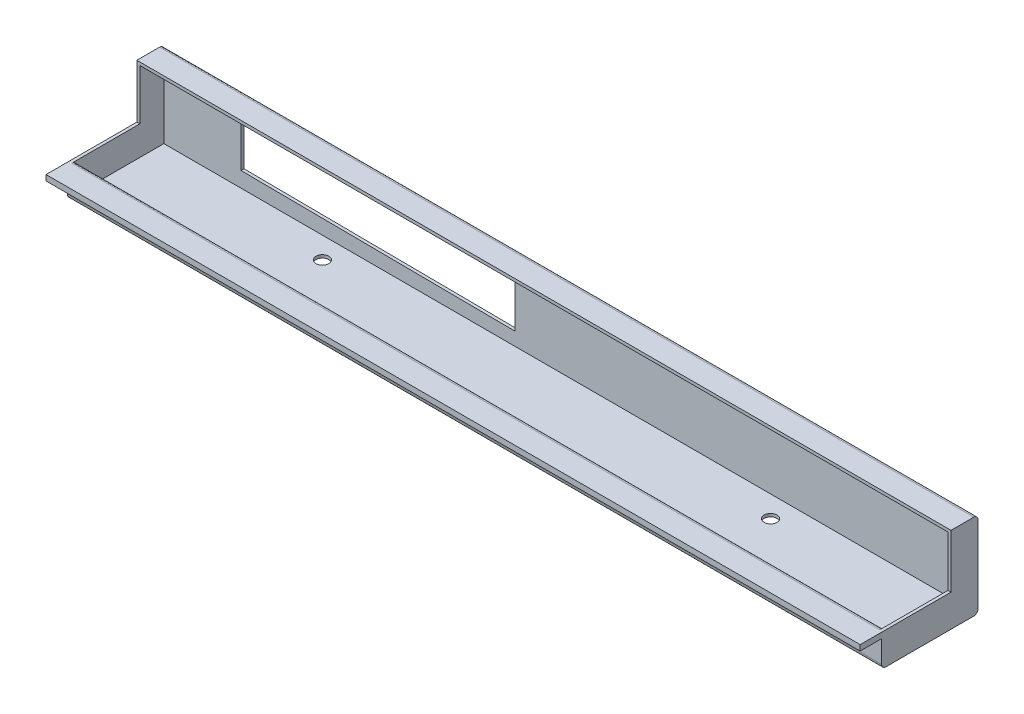
ISO-10303-21;
HEADER;
FILE_DESCRIPTION(('STEP AP214'),'2;1');
FILE_NAME('part.step','',(''),(''),'','','');
FILE_SCHEMA(('AUTOMOTIVE_DESIGN { 1 0 10303 214 1 1 1 1 }'));
ENDSEC;
DATA;
#1=APPLICATION_CONTEXT('core data for automotive mechanical design processes');
#2=APPLICATION_PROTOCOL_DEFINITION('international standard','automotive_design',2000,#1);
#3=PRODUCT_CONTEXT('',#1,'mechanical');
#4=PRODUCT('Part','Part','',(#3));
#5=PRODUCT_RELATED_PRODUCT_CATEGORY('part','',(#4));
#6=PRODUCT_DEFINITION_FORMATION('','',#4);
#7=PRODUCT_DEFINITION_CONTEXT('part definition',#1,'design');
#8=PRODUCT_DEFINITION('design','',#6,#7);
#9=PRODUCT_DEFINITION_SHAPE('','',#8);
#10=(LENGTH_UNIT() NAMED_UNIT(*) SI_UNIT(.MILLI.,.METRE.));
#11=(NAMED_UNIT(*) PLANE_ANGLE_UNIT() SI_UNIT($,.RADIAN.));
#12=(NAMED_UNIT(*) SI_UNIT($,.STERADIAN.) SOLID_ANGLE_UNIT());
#13=UNCERTAINTY_MEASURE_WITH_UNIT(LENGTH_MEASURE(1.E-05),#10,'distance_accuracy_value','');
#14=(GEOMETRIC_REPRESENTATION_CONTEXT(3) GLOBAL_UNCERTAINTY_ASSIGNED_CONTEXT((#13)) GLOBAL_UNIT_ASSIGNED_CONTEXT((#10,
#11,#12)) REPRESENTATION_CONTEXT('',''));
#15=CARTESIAN_POINT('',(0.,0.,0.));
#16=DIRECTION('',(0.,0.,1.));
#17=DIRECTION('',(1.,0.,0.));
#18=AXIS2_PLACEMENT_3D('',#15,#16,#17);
#19=CARTESIAN_POINT('',(0.,0.,1.778));
#20=DIRECTION('',(0.,0.,-1.));
#21=DIRECTION('',(-1.,0.,0.));
#22=AXIS2_PLACEMENT_3D('',#19,#20,#21);
#23=PLANE('',#22);
#24=DIRECTION('',(0.,1.,0.));
#25=VECTOR('',#24,1.);
#26=CARTESIAN_POINT('',(239.522,0.,1.778));
#27=LINE('',#26,#25);
#28=CARTESIAN_POINT('',(239.522,-23.622,1.778));
#29=VERTEX_POINT('',#28);
#30=CARTESIAN_POINT('',(239.522,23.622,1.778));
#31=VERTEX_POINT('',#30);
#32=EDGE_CURVE('E241',#29,#31,#27,.T.);
#33=ORIENTED_EDGE('',*,*,#32,.T.);
#34=DIRECTION('',(-1.,0.,0.));
#35=VECTOR('',#34,1.);
#36=CARTESIAN_POINT('',(0.,23.622,1.778));
#37=LINE('',#36,#35);
#38=CARTESIAN_POINT('',(-239.522,23.622,1.778));
#39=VERTEX_POINT('',#38);
#40=EDGE_CURVE('E244',#31,#39,#37,.T.);
#41=ORIENTED_EDGE('',*,*,#40,.T.);
#42=DIRECTION('',(0.,-1.,0.));
#43=VECTOR('',#42,1.);
#44=CARTESIAN_POINT('',(-239.522,0.,1.778));
#45=LINE('',#44,#43);
#46=CARTESIAN_POINT('',(-239.522,-23.622,1.778));
#47=VERTEX_POINT('',#46);
#48=EDGE_CURVE('E251',#39,#47,#45,.T.);
#49=ORIENTED_EDGE('',*,*,#48,.T.);
#50=DIRECTION('',(1.,0.,0.));
#51=VECTOR('',#50,1.);
#52=CARTESIAN_POINT('',(0.,-23.622,1.778));
#53=LINE('',#52,#51);
#54=EDGE_CURVE('E240',#47,#29,#53,.T.);
#55=ORIENTED_EDGE('',*,*,#54,.T.);
#56=EDGE_LOOP('',(#33,#41,#49,#55));
#57=FACE_BOUND('',#56,.T.);
#58=DIRECTION('',(0.,1.,0.));
#59=VECTOR('',#58,1.);
#60=CARTESIAN_POINT('',(-31.482,13.4000000000001,1.778));
#61=LINE('',#60,#59);
#62=CARTESIAN_POINT('',(-31.482,-15.8099999999999,1.778));
#63=VERTEX_POINT('',#62);
#64=CARTESIAN_POINT('',(-31.482,13.4000000000001,1.778));
#65=VERTEX_POINT('',#64);
#66=EDGE_CURVE('E202',#63,#65,#61,.T.);
#67=ORIENTED_EDGE('',*,*,#66,.F.);
#68=DIRECTION('',(0.999969941431807,-0.00775346586175069,0.));
#69=VECTOR('',#68,1.);
#70=CARTESIAN_POINT('',(-31.482,-15.8099999999999,1.778));
#71=LINE('',#70,#69);
#72=CARTESIAN_POINT('',(-193.836883288076,-14.5511491156821,1.778));
#73=VERTEX_POINT('',#72);
#74=EDGE_CURVE('E206',#73,#63,#71,.T.);
#75=ORIENTED_EDGE('',*,*,#74,.F.);
#76=DIRECTION('',(0.,-1.,0.));
#77=VECTOR('',#76,1.);
#78=CARTESIAN_POINT('',(-193.836883288076,-14.5511491156821,1.778));
#79=LINE('',#78,#77);
#80=CARTESIAN_POINT('',(-193.836883288076,13.4000000000001,1.778));
#81=VERTEX_POINT('',#80);
#82=EDGE_CURVE('E56',#81,#73,#79,.T.);
#83=ORIENTED_EDGE('',*,*,#82,.F.);
#84=DIRECTION('',(-1.,0.,0.));
#85=VECTOR('',#84,1.);
#86=CARTESIAN_POINT('',(-193.836883288076,13.4000000000001,1.778));
#87=LINE('',#86,#85);
#88=EDGE_CURVE('E197',#65,#81,#87,.T.);
#89=ORIENTED_EDGE('',*,*,#88,.F.);
#90=EDGE_LOOP('',(#67,#75,#83,#89));
#91=FACE_BOUND('',#90,.T.);
#92=ADVANCED_FACE('F39',(#57,#91),#23,.F.);
#93=CARTESIAN_POINT('',(0.,-23.622,0.));
#94=DIRECTION('',(0.,1.,0.));
#95=DIRECTION('',(0.,0.,1.));
#96=AXIS2_PLACEMENT_3D('',#93,#94,#95);
#97=PLANE('',#96);
#98=CARTESIAN_POINT('',(132.842,-23.622,14.4780000000006));
#99=DIRECTION('',(0.,-1.,0.));
#100=DIRECTION('',(0.,0.,-1.));
#101=AXIS2_PLACEMENT_3D('',#98,#99,#100);
#102=CIRCLE('',#101,3.81000000000002);
#103=CARTESIAN_POINT('',(132.842,-23.622,10.6680000000006));
#104=VERTEX_POINT('',#103);
#105=EDGE_CURVE('E208',#104,#104,#102,.T.);
#106=ORIENTED_EDGE('',*,*,#105,.T.);
#107=EDGE_LOOP('',(#106));
#108=FACE_BOUND('',#107,.T.);
#109=DIRECTION('',(1.,0.,0.));
#110=VECTOR('',#109,1.);
#111=CARTESIAN_POINT('',(0.,-23.622,53.848));
#112=LINE('',#111,#110);
#113=CARTESIAN_POINT('',(-239.522,-23.622,53.848));
#114=VERTEX_POINT('',#113);
#115=CARTESIAN_POINT('',(239.522,-23.6220000000009,53.848));
#116=VERTEX_POINT('',#115);
#117=EDGE_CURVE('E286',#114,#116,#112,.T.);
#118=ORIENTED_EDGE('',*,*,#117,.T.);
#119=DIRECTION('',(0.,0.,-1.));
#120=VECTOR('',#119,1.);
#121=CARTESIAN_POINT('',(239.522,-23.622,69.85));
#122=LINE('',#121,#120);
#123=EDGE_CURVE('E237',#116,#29,#122,.T.);
#124=ORIENTED_EDGE('',*,*,#123,.T.);
#125=ORIENTED_EDGE('',*,*,#54,.F.);
#126=DIRECTION('',(0.,0.,-1.));
#127=VECTOR('',#126,1.);
#128=CARTESIAN_POINT('',(-239.522,-23.622,69.85));
#129=LINE('',#128,#127);
#130=EDGE_CURVE('E239',#114,#47,#129,.T.);
#131=ORIENTED_EDGE('',*,*,#130,.F.);
#132=EDGE_LOOP('',(#118,#124,#125,#131));
#133=FACE_BOUND('',#132,.T.);
#134=CARTESIAN_POINT('',(-132.842,-23.622,14.478));
#135=DIRECTION('',(0.,1.,0.));
#136=DIRECTION('',(0.,0.,1.));
#137=AXIS2_PLACEMENT_3D('',#134,#135,#136);
#138=CIRCLE('',#137,3.81000000000001);
#139=CARTESIAN_POINT('',(-132.842,-23.622,18.288));
#140=VERTEX_POINT('',#139);
#141=EDGE_CURVE('E215',#140,#140,#138,.T.);
#142=ORIENTED_EDGE('',*,*,#141,.F.);
#143=EDGE_LOOP('',(#142));
#144=FACE_BOUND('',#143,.T.);
#145=ADVANCED_FACE('F372',(#108,#133,#144),#97,.T.);
#146=CARTESIAN_POINT('',(-241.3,-25.4,69.85));
#147=DIRECTION('',(0.,1.,0.));
#148=DIRECTION('',(0.,0.,1.));
#149=AXIS2_PLACEMENT_3D('',#146,#147,#148);
#150=PLANE('',#149);
#151=DIRECTION('',(0.,0.,-1.));
#152=VECTOR('',#151,1.);
#153=CARTESIAN_POINT('',(241.3,-25.4,69.85));
#154=LINE('',#153,#152);
#155=CARTESIAN_POINT('',(241.3,-25.4,54.61));
#156=VERTEX_POINT('',#155);
#157=CARTESIAN_POINT('',(241.3,-25.4,2.54));
#158=VERTEX_POINT('',#157);
#159=EDGE_CURVE('E302',#156,#158,#154,.T.);
#160=ORIENTED_EDGE('',*,*,#159,.F.);
#161=DIRECTION('',(1.,0.,0.));
#162=VECTOR('',#161,1.);
#163=CARTESIAN_POINT('',(-241.3,-25.4,54.61));
#164=LINE('',#163,#162);
#165=CARTESIAN_POINT('',(-241.3,-25.4,54.61));
#166=VERTEX_POINT('',#165);
#167=EDGE_CURVE('E335',#156,#166,#164,.F.);
#168=ORIENTED_EDGE('',*,*,#167,.T.);
#169=DIRECTION('',(0.,0.,-1.));
#170=VECTOR('',#169,1.);
#171=CARTESIAN_POINT('',(-241.3,-25.4,69.85));
#172=LINE('',#171,#170);
#173=CARTESIAN_POINT('',(-241.3,-25.4,2.54));
#174=VERTEX_POINT('',#173);
#175=EDGE_CURVE('E309',#166,#174,#172,.T.);
#176=ORIENTED_EDGE('',*,*,#175,.T.);
#177=DIRECTION('',(1.,0.,0.));
#178=VECTOR('',#177,1.);
#179=CARTESIAN_POINT('',(241.3,-25.4,2.54));
#180=LINE('',#179,#178);
#181=EDGE_CURVE('E332',#174,#158,#180,.T.);
#182=ORIENTED_EDGE('',*,*,#181,.T.);
#183=EDGE_LOOP('',(#160,#168,#176,#182));
#184=FACE_BOUND('',#183,.T.);
#185=CARTESIAN_POINT('',(132.842,-25.4,14.4780000000006));
#186=DIRECTION('',(0.,1.,0.));
#187=DIRECTION('',(0.,0.,1.));
#188=AXIS2_PLACEMENT_3D('',#185,#186,#187);
#189=CIRCLE('',#188,3.81000000000002);
#190=CARTESIAN_POINT('',(132.842,-25.4,18.2880000000006));
#191=VERTEX_POINT('',#190);
#192=EDGE_CURVE('E218',#191,#191,#189,.F.);
#193=ORIENTED_EDGE('',*,*,#192,.F.);
#194=EDGE_LOOP('',(#193));
#195=FACE_BOUND('',#194,.T.);
#196=CARTESIAN_POINT('',(-132.842,-25.4,14.478));
#197=DIRECTION('',(0.,1.,0.));
#198=DIRECTION('',(0.,0.,1.));
#199=AXIS2_PLACEMENT_3D('',#196,#197,#198);
#200=CIRCLE('',#199,3.81000000000001);
#201=CARTESIAN_POINT('',(-132.842,-25.4,18.288));
#202=VERTEX_POINT('',#201);
#203=EDGE_CURVE('E43',#202,#202,#200,.T.);
#204=ORIENTED_EDGE('',*,*,#203,.T.);
#205=EDGE_LOOP('',(#204));
#206=FACE_BOUND('',#205,.T.);
#207=ADVANCED_FACE('F356',(#184,#195,#206),#150,.F.);
#208=CARTESIAN_POINT('',(0.,-23.622,53.848));
#209=DIRECTION('',(0.,0.,1.));
#210=DIRECTION('',(1.,0.,0.));
#211=AXIS2_PLACEMENT_3D('',#208,#209,#210);
#212=PLANE('',#211);
#213=DIRECTION('',(0.,1.,0.));
#214=VECTOR('',#213,1.);
#215=CARTESIAN_POINT('',(-239.522,0.,53.848));
#216=LINE('',#215,#214);
#217=CARTESIAN_POINT('',(-239.522,-8.89,53.848));
#218=VERTEX_POINT('',#217);
#219=EDGE_CURVE('E228',#114,#218,#216,.T.);
#220=ORIENTED_EDGE('',*,*,#219,.T.);
#221=DIRECTION('',(-1.,0.,0.));
#222=VECTOR('',#221,1.);
#223=CARTESIAN_POINT('',(239.522,-8.89,53.848));
#224=LINE('',#223,#222);
#225=CARTESIAN_POINT('',(239.522,-8.89,53.848));
#226=VERTEX_POINT('',#225);
#227=EDGE_CURVE('E321',#218,#226,#224,.F.);
#228=ORIENTED_EDGE('',*,*,#227,.T.);
#229=DIRECTION('',(0.,1.,0.));
#230=VECTOR('',#229,1.);
#231=CARTESIAN_POINT('',(239.522,-23.6220000000009,53.848));
#232=LINE('',#231,#230);
#233=EDGE_CURVE('E223',#116,#226,#232,.T.);
#234=ORIENTED_EDGE('',*,*,#233,.F.);
#235=ORIENTED_EDGE('',*,*,#117,.F.);
#236=EDGE_LOOP('',(#220,#228,#234,#235));
#237=FACE_BOUND('',#236,.T.);
#238=ADVANCED_FACE('F402',(#237),#212,.F.);
#239=CARTESIAN_POINT('',(0.,-23.622,16.002));
#240=DIRECTION('',(0.,0.,1.));
#241=DIRECTION('',(1.,0.,0.));
#242=AXIS2_PLACEMENT_3D('',#239,#240,#241);
#243=PLANE('',#242);
#244=DIRECTION('',(-1.,0.,0.));
#245=VECTOR('',#244,1.);
#246=CARTESIAN_POINT('',(0.,-6.34999999999999,16.002));
#247=LINE('',#246,#245);
#248=CARTESIAN_POINT('',(241.3,-6.35000000000093,16.002));
#249=VERTEX_POINT('',#248);
#250=CARTESIAN_POINT('',(239.522,-6.35000000000092,16.002));
#251=VERTEX_POINT('',#250);
#252=EDGE_CURVE('E226',#249,#251,#247,.T.);
#253=ORIENTED_EDGE('',*,*,#252,.F.);
#254=DIRECTION('',(0.,1.,0.));
#255=VECTOR('',#254,1.);
#256=CARTESIAN_POINT('',(241.3,-23.622,16.002));
#257=LINE('',#256,#255);
#258=CARTESIAN_POINT('',(241.3,25.4,16.002));
#259=VERTEX_POINT('',#258);
#260=EDGE_CURVE('E289',#249,#259,#257,.T.);
#261=ORIENTED_EDGE('',*,*,#260,.T.);
#262=DIRECTION('',(1.,0.,0.));
#263=VECTOR('',#262,1.);
#264=CARTESIAN_POINT('',(0.,25.4,16.002));
#265=LINE('',#264,#263);
#266=CARTESIAN_POINT('',(-241.3,25.4,16.002));
#267=VERTEX_POINT('',#266);
#268=EDGE_CURVE('E285',#267,#259,#265,.T.);
#269=ORIENTED_EDGE('',*,*,#268,.F.);
#270=DIRECTION('',(0.,1.,0.));
#271=VECTOR('',#270,1.);
#272=CARTESIAN_POINT('',(-241.3,-23.622,16.002));
#273=LINE('',#272,#271);
#274=CARTESIAN_POINT('',(-241.3,-6.34999999999999,16.002));
#275=VERTEX_POINT('',#274);
#276=EDGE_CURVE('E292',#275,#267,#273,.T.);
#277=ORIENTED_EDGE('',*,*,#276,.F.);
#278=DIRECTION('',(1.,0.,0.));
#279=VECTOR('',#278,1.);
#280=CARTESIAN_POINT('',(0.,-6.34999999999999,16.002));
#281=LINE('',#280,#279);
#282=CARTESIAN_POINT('',(-239.522,-6.34999999999999,16.002));
#283=VERTEX_POINT('',#282);
#284=EDGE_CURVE('E233',#275,#283,#281,.T.);
#285=ORIENTED_EDGE('',*,*,#284,.T.);
#286=DIRECTION('',(0.,1.,0.));
#287=VECTOR('',#286,1.);
#288=CARTESIAN_POINT('',(-239.522,-23.622,16.002));
#289=LINE('',#288,#287);
#290=CARTESIAN_POINT('',(-239.522,23.622,16.002));
#291=VERTEX_POINT('',#290);
#292=EDGE_CURVE('E245',#283,#291,#289,.T.);
#293=ORIENTED_EDGE('',*,*,#292,.T.);
#294=DIRECTION('',(1.,0.,0.));
#295=VECTOR('',#294,1.);
#296=CARTESIAN_POINT('',(0.,23.622,16.002));
#297=LINE('',#296,#295);
#298=CARTESIAN_POINT('',(239.522,23.622,16.002));
#299=VERTEX_POINT('',#298);
#300=EDGE_CURVE('E236',#291,#299,#297,.T.);
#301=ORIENTED_EDGE('',*,*,#300,.T.);
#302=DIRECTION('',(0.,1.,0.));
#303=VECTOR('',#302,1.);
#304=CARTESIAN_POINT('',(239.522,-25.4,16.002));
#305=LINE('',#304,#303);
#306=EDGE_CURVE('E259',#251,#299,#305,.T.);
#307=ORIENTED_EDGE('',*,*,#306,.F.);
#308=EDGE_LOOP('',(#253,#261,#269,#277,#285,#293,#301,#307));
#309=FACE_BOUND('',#308,.T.);
#310=ADVANCED_FACE('F398',(#309),#243,.T.);
#311=CARTESIAN_POINT('',(241.3,-25.4,69.85));
#312=DIRECTION('',(-1.,0.,0.));
#313=DIRECTION('',(0.,0.,1.));
#314=AXIS2_PLACEMENT_3D('',#311,#312,#313);
#315=PLANE('',#314);
#316=DIRECTION('',(0.,1.,0.));
#317=VECTOR('',#316,1.);
#318=CARTESIAN_POINT('',(241.3,-25.4,57.15));
#319=LINE('',#318,#317);
#320=CARTESIAN_POINT('',(241.3,-22.86,57.15));
#321=VERTEX_POINT('',#320);
#322=CARTESIAN_POINT('',(241.3,-9.65199999999999,57.15));
#323=VERTEX_POINT('',#322);
#324=EDGE_CURVE('E267',#321,#323,#319,.T.);
#325=ORIENTED_EDGE('',*,*,#324,.F.);
#326=CARTESIAN_POINT('',(241.3,-22.86,54.61));
#327=DIRECTION('',(-1.,0.,0.));
#328=DIRECTION('',(0.,0.,1.));
#329=AXIS2_PLACEMENT_3D('',#326,#327,#328);
#330=CIRCLE('',#329,2.54);
#331=EDGE_CURVE('E330',#321,#156,#330,.F.);
#332=ORIENTED_EDGE('',*,*,#331,.T.);
#333=ORIENTED_EDGE('',*,*,#159,.T.);
#334=CARTESIAN_POINT('',(241.3,-22.86,2.54));
#335=DIRECTION('',(-1.,0.,0.));
#336=DIRECTION('',(0.,0.,1.));
#337=AXIS2_PLACEMENT_3D('',#334,#335,#336);
#338=CIRCLE('',#337,2.54);
#339=CARTESIAN_POINT('',(241.3,-22.86,0.));
#340=VERTEX_POINT('',#339);
#341=EDGE_CURVE('E328',#158,#340,#338,.F.);
#342=ORIENTED_EDGE('',*,*,#341,.T.);
#343=DIRECTION('',(0.,1.,0.));
#344=VECTOR('',#343,1.);
#345=CARTESIAN_POINT('',(241.3,-25.4,0.));
#346=LINE('',#345,#344);
#347=CARTESIAN_POINT('',(241.3,22.86,0.));
#348=VERTEX_POINT('',#347);
#349=EDGE_CURVE('E294',#340,#348,#346,.T.);
#350=ORIENTED_EDGE('',*,*,#349,.T.);
#351=CARTESIAN_POINT('',(241.3,22.86,2.54));
#352=DIRECTION('',(-1.,0.,0.));
#353=DIRECTION('',(0.,0.,1.));
#354=AXIS2_PLACEMENT_3D('',#351,#352,#353);
#355=CIRCLE('',#354,2.54);
#356=CARTESIAN_POINT('',(241.3,25.4,2.54));
#357=VERTEX_POINT('',#356);
#358=EDGE_CURVE('E326',#348,#357,#355,.F.);
#359=ORIENTED_EDGE('',*,*,#358,.T.);
#360=DIRECTION('',(0.,0.,-1.));
#361=VECTOR('',#360,1.);
#362=CARTESIAN_POINT('',(241.3,25.4,69.85));
#363=LINE('',#362,#361);
#364=EDGE_CURVE('E315',#259,#357,#363,.T.);
#365=ORIENTED_EDGE('',*,*,#364,.F.);
#366=ORIENTED_EDGE('',*,*,#260,.F.);
#367=DIRECTION('',(0.,0.,-1.));
#368=VECTOR('',#367,1.);
#369=CARTESIAN_POINT('',(241.3,-6.34999999999999,53.848));
#370=LINE('',#369,#368);
#371=CARTESIAN_POINT('',(241.3,-6.34999999999999,69.85));
#372=VERTEX_POINT('',#371);
#373=EDGE_CURVE('E283',#372,#249,#370,.T.);
#374=ORIENTED_EDGE('',*,*,#373,.F.);
#375=DIRECTION('',(0.,1.,0.));
#376=VECTOR('',#375,1.);
#377=CARTESIAN_POINT('',(241.3,-25.4,69.85));
#378=LINE('',#377,#376);
#379=CARTESIAN_POINT('',(241.3,-9.65199999999999,69.85));
#380=VERTEX_POINT('',#379);
#381=EDGE_CURVE('E296',#380,#372,#378,.T.);
#382=ORIENTED_EDGE('',*,*,#381,.F.);
#383=DIRECTION('',(0.,0.,1.));
#384=VECTOR('',#383,1.);
#385=CARTESIAN_POINT('',(241.3,-9.65199999999999,57.15));
#386=LINE('',#385,#384);
#387=EDGE_CURVE('E272',#323,#380,#386,.T.);
#388=ORIENTED_EDGE('',*,*,#387,.F.);
#389=EDGE_LOOP('',(#325,#332,#333,#342,#350,#359,#365,#366,#374,#382,#388));
#390=FACE_BOUND('',#389,.T.);
#391=ADVANCED_FACE('F401',(#390),#315,.F.);
#392=CARTESIAN_POINT('',(-241.3,-25.4,69.85));
#393=DIRECTION('',(1.,0.,0.));
#394=DIRECTION('',(0.,0.,-1.));
#395=AXIS2_PLACEMENT_3D('',#392,#393,#394);
#396=PLANE('',#395);
#397=ORIENTED_EDGE('',*,*,#175,.F.);
#398=CARTESIAN_POINT('',(-241.3,-22.86,54.61));
#399=DIRECTION('',(1.,0.,0.));
#400=DIRECTION('',(0.,0.,-1.));
#401=AXIS2_PLACEMENT_3D('',#398,#399,#400);
#402=CIRCLE('',#401,2.54);
#403=CARTESIAN_POINT('',(-241.3,-22.86,57.15));
#404=VERTEX_POINT('',#403);
#405=EDGE_CURVE('E341',#166,#404,#402,.F.);
#406=ORIENTED_EDGE('',*,*,#405,.T.);
#407=DIRECTION('',(0.,-1.,0.));
#408=VECTOR('',#407,1.);
#409=CARTESIAN_POINT('',(-241.3,-25.4,57.15));
#410=LINE('',#409,#408);
#411=CARTESIAN_POINT('',(-241.3,-9.65199999999999,57.15));
#412=VERTEX_POINT('',#411);
#413=EDGE_CURVE('E264',#412,#404,#410,.T.);
#414=ORIENTED_EDGE('',*,*,#413,.F.);
#415=DIRECTION('',(0.,0.,1.));
#416=VECTOR('',#415,1.);
#417=CARTESIAN_POINT('',(-241.3,-9.65199999999999,57.15));
#418=LINE('',#417,#416);
#419=CARTESIAN_POINT('',(-241.3,-9.65199999999999,69.85));
#420=VERTEX_POINT('',#419);
#421=EDGE_CURVE('E274',#412,#420,#418,.T.);
#422=ORIENTED_EDGE('',*,*,#421,.T.);
#423=DIRECTION('',(0.,-1.,0.));
#424=VECTOR('',#423,1.);
#425=CARTESIAN_POINT('',(-241.3,-25.4,69.85));
#426=LINE('',#425,#424);
#427=CARTESIAN_POINT('',(-241.3,-6.34999999999999,69.85));
#428=VERTEX_POINT('',#427);
#429=EDGE_CURVE('E298',#428,#420,#426,.T.);
#430=ORIENTED_EDGE('',*,*,#429,.F.);
#431=DIRECTION('',(0.,0.,1.));
#432=VECTOR('',#431,1.);
#433=CARTESIAN_POINT('',(-241.3,-6.34999999999999,53.848));
#434=LINE('',#433,#432);
#435=EDGE_CURVE('E277',#275,#428,#434,.T.);
#436=ORIENTED_EDGE('',*,*,#435,.F.);
#437=ORIENTED_EDGE('',*,*,#276,.T.);
#438=DIRECTION('',(0.,0.,-1.));
#439=VECTOR('',#438,1.);
#440=CARTESIAN_POINT('',(-241.3,25.4,69.85));
#441=LINE('',#440,#439);
#442=CARTESIAN_POINT('',(-241.3,25.4,2.54));
#443=VERTEX_POINT('',#442);
#444=EDGE_CURVE('E312',#267,#443,#441,.T.);
#445=ORIENTED_EDGE('',*,*,#444,.T.);
#446=CARTESIAN_POINT('',(-241.3,22.86,2.54));
#447=DIRECTION('',(1.,0.,0.));
#448=DIRECTION('',(0.,0.,-1.));
#449=AXIS2_PLACEMENT_3D('',#446,#447,#448);
#450=CIRCLE('',#449,2.54);
#451=CARTESIAN_POINT('',(-241.3,22.86,0.));
#452=VERTEX_POINT('',#451);
#453=EDGE_CURVE('E337',#443,#452,#450,.F.);
#454=ORIENTED_EDGE('',*,*,#453,.T.);
#455=DIRECTION('',(0.,-1.,0.));
#456=VECTOR('',#455,1.);
#457=CARTESIAN_POINT('',(-241.3,-25.4,0.));
#458=LINE('',#457,#456);
#459=CARTESIAN_POINT('',(-241.3,-22.86,0.));
#460=VERTEX_POINT('',#459);
#461=EDGE_CURVE('E299',#452,#460,#458,.T.);
#462=ORIENTED_EDGE('',*,*,#461,.T.);
#463=CARTESIAN_POINT('',(-241.3,-22.86,2.54));
#464=DIRECTION('',(1.,0.,0.));
#465=DIRECTION('',(0.,0.,-1.));
#466=AXIS2_PLACEMENT_3D('',#463,#464,#465);
#467=CIRCLE('',#466,2.54);
#468=EDGE_CURVE('E339',#460,#174,#467,.F.);
#469=ORIENTED_EDGE('',*,*,#468,.T.);
#470=EDGE_LOOP('',(#397,#406,#414,#422,#430,#436,#437,#445,#454,#462,#469));
#471=FACE_BOUND('',#470,.T.);
#472=ADVANCED_FACE('F411',(#471),#396,.F.);
#473=CARTESIAN_POINT('',(0.,0.,69.85));
#474=DIRECTION('',(0.,0.,-1.));
#475=DIRECTION('',(-1.,0.,0.));
#476=AXIS2_PLACEMENT_3D('',#473,#474,#475);
#477=PLANE('',#476);
#478=ORIENTED_EDGE('',*,*,#429,.T.);
#479=DIRECTION('',(-1.,0.,0.));
#480=VECTOR('',#479,1.);
#481=CARTESIAN_POINT('',(-241.3,-9.65199999999999,69.85));
#482=LINE('',#481,#480);
#483=EDGE_CURVE('E248',#380,#420,#482,.T.);
#484=ORIENTED_EDGE('',*,*,#483,.F.);
#485=ORIENTED_EDGE('',*,*,#381,.T.);
#486=DIRECTION('',(1.,0.,0.));
#487=VECTOR('',#486,1.);
#488=CARTESIAN_POINT('',(-241.3,-6.34999999999999,69.85));
#489=LINE('',#488,#487);
#490=EDGE_CURVE('E280',#428,#372,#489,.T.);
#491=ORIENTED_EDGE('',*,*,#490,.F.);
#492=EDGE_LOOP('',(#478,#484,#485,#491));
#493=FACE_BOUND('',#492,.T.);
#494=ADVANCED_FACE('F407',(#493),#477,.F.);
#495=CARTESIAN_POINT('',(-241.3,25.4,69.85));
#496=DIRECTION('',(0.,-1.,0.));
#497=DIRECTION('',(0.,0.,-1.));
#498=AXIS2_PLACEMENT_3D('',#495,#496,#497);
#499=PLANE('',#498);
#500=ORIENTED_EDGE('',*,*,#364,.T.);
#501=DIRECTION('',(-1.,0.,0.));
#502=VECTOR('',#501,1.);
#503=CARTESIAN_POINT('',(-241.3,25.4,2.54));
#504=LINE('',#503,#502);
#505=EDGE_CURVE('E347',#357,#443,#504,.T.);
#506=ORIENTED_EDGE('',*,*,#505,.T.);
#507=ORIENTED_EDGE('',*,*,#444,.F.);
#508=ORIENTED_EDGE('',*,*,#268,.T.);
#509=EDGE_LOOP('',(#500,#506,#507,#508));
#510=FACE_BOUND('',#509,.T.);
#511=ADVANCED_FACE('F410',(#510),#499,.F.);
#512=CARTESIAN_POINT('',(0.,0.,0.));
#513=DIRECTION('',(0.,0.,-1.));
#514=DIRECTION('',(-1.,0.,0.));
#515=AXIS2_PLACEMENT_3D('',#512,#513,#514);
#516=PLANE('',#515);
#517=DIRECTION('',(1.,0.,0.));
#518=VECTOR('',#517,1.);
#519=CARTESIAN_POINT('',(-193.836883288076,13.4000000000001,0.));
#520=LINE('',#519,#518);
#521=CARTESIAN_POINT('',(-193.836883288076,13.4000000000001,0.));
#522=VERTEX_POINT('',#521);
#523=CARTESIAN_POINT('',(-31.482,13.4000000000001,0.));
#524=VERTEX_POINT('',#523);
#525=EDGE_CURVE('E64',#522,#524,#520,.T.);
#526=ORIENTED_EDGE('',*,*,#525,.F.);
#527=DIRECTION('',(0.,1.,0.));
#528=VECTOR('',#527,1.);
#529=CARTESIAN_POINT('',(-193.836883288076,-14.5511491156821,0.));
#530=LINE('',#529,#528);
#531=CARTESIAN_POINT('',(-193.836883288076,-14.5511491156821,0.));
#532=VERTEX_POINT('',#531);
#533=EDGE_CURVE('E192',#532,#522,#530,.T.);
#534=ORIENTED_EDGE('',*,*,#533,.F.);
#535=DIRECTION('',(-0.999969941431807,0.00775346586175069,0.));
#536=VECTOR('',#535,1.);
#537=CARTESIAN_POINT('',(-31.482,-15.8099999999999,0.));
#538=LINE('',#537,#536);
#539=CARTESIAN_POINT('',(-31.482,-15.8099999999999,0.));
#540=VERTEX_POINT('',#539);
#541=EDGE_CURVE('E686',#540,#532,#538,.T.);
#542=ORIENTED_EDGE('',*,*,#541,.F.);
#543=DIRECTION('',(0.,-1.,0.));
#544=VECTOR('',#543,1.);
#545=CARTESIAN_POINT('',(-31.482,13.4000000000001,0.));
#546=LINE('',#545,#544);
#547=EDGE_CURVE('E692',#524,#540,#546,.T.);
#548=ORIENTED_EDGE('',*,*,#547,.F.);
#549=EDGE_LOOP('',(#526,#534,#542,#548));
#550=FACE_BOUND('',#549,.T.);
#551=ORIENTED_EDGE('',*,*,#349,.F.);
#552=DIRECTION('',(1.,0.,0.));
#553=VECTOR('',#552,1.);
#554=CARTESIAN_POINT('',(-241.3,-22.86,0.));
#555=LINE('',#554,#553);
#556=EDGE_CURVE('E345',#340,#460,#555,.F.);
#557=ORIENTED_EDGE('',*,*,#556,.T.);
#558=ORIENTED_EDGE('',*,*,#461,.F.);
#559=DIRECTION('',(-1.,0.,0.));
#560=VECTOR('',#559,1.);
#561=CARTESIAN_POINT('',(241.3,22.86,0.));
#562=LINE('',#561,#560);
#563=EDGE_CURVE('E343',#452,#348,#562,.F.);
#564=ORIENTED_EDGE('',*,*,#563,.T.);
#565=EDGE_LOOP('',(#551,#557,#558,#564));
#566=FACE_BOUND('',#565,.T.);
#567=ADVANCED_FACE('F395',(#550,#566),#516,.T.);
#568=CARTESIAN_POINT('',(0.,-6.34999999999999,0.));
#569=DIRECTION('',(0.,1.,0.));
#570=DIRECTION('',(0.,0.,1.));
#571=AXIS2_PLACEMENT_3D('',#568,#569,#570);
#572=PLANE('',#571);
#573=DIRECTION('',(-1.,0.,0.));
#574=VECTOR('',#573,1.);
#575=CARTESIAN_POINT('',(-239.522,-6.34999999999999,56.388));
#576=LINE('',#575,#574);
#577=CARTESIAN_POINT('',(239.522,-6.35000000000092,56.388));
#578=VERTEX_POINT('',#577);
#579=CARTESIAN_POINT('',(-239.522,-6.34999999999999,56.388));
#580=VERTEX_POINT('',#579);
#581=EDGE_CURVE('E318',#578,#580,#576,.T.);
#582=ORIENTED_EDGE('',*,*,#581,.T.);
#583=DIRECTION('',(0.,0.,1.));
#584=VECTOR('',#583,1.);
#585=CARTESIAN_POINT('',(-239.522,-6.34999999999999,9.398));
#586=LINE('',#585,#584);
#587=EDGE_CURVE('E231',#283,#580,#586,.T.);
#588=ORIENTED_EDGE('',*,*,#587,.F.);
#589=ORIENTED_EDGE('',*,*,#284,.F.);
#590=ORIENTED_EDGE('',*,*,#435,.T.);
#591=ORIENTED_EDGE('',*,*,#490,.T.);
#592=ORIENTED_EDGE('',*,*,#373,.T.);
#593=ORIENTED_EDGE('',*,*,#252,.T.);
#594=DIRECTION('',(0.,0.,1.));
#595=VECTOR('',#594,1.);
#596=CARTESIAN_POINT('',(239.522,-6.35000000000092,9.398));
#597=LINE('',#596,#595);
#598=EDGE_CURVE('E221',#251,#578,#597,.T.);
#599=ORIENTED_EDGE('',*,*,#598,.T.);
#600=EDGE_LOOP('',(#582,#588,#589,#590,#591,#592,#593,#599));
#601=FACE_BOUND('',#600,.T.);
#602=ADVANCED_FACE('F392',(#601),#572,.T.);
#603=CARTESIAN_POINT('',(-241.3,-9.65199999999999,57.15));
#604=DIRECTION('',(0.,1.,0.));
#605=DIRECTION('',(0.,0.,1.));
#606=AXIS2_PLACEMENT_3D('',#603,#604,#605);
#607=PLANE('',#606);
#608=ORIENTED_EDGE('',*,*,#483,.T.);
#609=ORIENTED_EDGE('',*,*,#421,.F.);
#610=DIRECTION('',(-1.,0.,0.));
#611=VECTOR('',#610,1.);
#612=CARTESIAN_POINT('',(-241.3,-9.65199999999999,57.15));
#613=LINE('',#612,#611);
#614=EDGE_CURVE('E269',#323,#412,#613,.T.);
#615=ORIENTED_EDGE('',*,*,#614,.F.);
#616=ORIENTED_EDGE('',*,*,#387,.T.);
#617=EDGE_LOOP('',(#608,#609,#615,#616));
#618=FACE_BOUND('',#617,.T.);
#619=ADVANCED_FACE('F388',(#618),#607,.F.);
#620=CARTESIAN_POINT('',(0.,0.,57.15));
#621=DIRECTION('',(0.,0.,-1.));
#622=DIRECTION('',(-1.,0.,0.));
#623=AXIS2_PLACEMENT_3D('',#620,#621,#622);
#624=PLANE('',#623);
#625=ORIENTED_EDGE('',*,*,#413,.T.);
#626=DIRECTION('',(1.,0.,0.));
#627=VECTOR('',#626,1.);
#628=CARTESIAN_POINT('',(0.,-22.86,57.15));
#629=LINE('',#628,#627);
#630=EDGE_CURVE('E323',#404,#321,#629,.T.);
#631=ORIENTED_EDGE('',*,*,#630,.T.);
#632=ORIENTED_EDGE('',*,*,#324,.T.);
#633=ORIENTED_EDGE('',*,*,#614,.T.);
#634=EDGE_LOOP('',(#625,#631,#632,#633));
#635=FACE_BOUND('',#634,.T.);
#636=ADVANCED_FACE('F384',(#635),#624,.F.);
#637=CARTESIAN_POINT('',(239.522,-25.4,69.85));
#638=DIRECTION('',(-1.,0.,0.));
#639=DIRECTION('',(0.,0.,1.));
#640=AXIS2_PLACEMENT_3D('',#637,#638,#639);
#641=PLANE('',#640);
#642=ORIENTED_EDGE('',*,*,#123,.F.);
#643=ORIENTED_EDGE('',*,*,#233,.T.);
#644=CARTESIAN_POINT('',(239.522,-8.89,56.388));
#645=DIRECTION('',(-1.,0.,0.));
#646=DIRECTION('',(0.,0.,1.));
#647=AXIS2_PLACEMENT_3D('',#644,#645,#646);
#648=CIRCLE('',#647,2.54);
#649=EDGE_CURVE('E11',#226,#578,#648,.F.);
#650=ORIENTED_EDGE('',*,*,#649,.T.);
#651=ORIENTED_EDGE('',*,*,#598,.F.);
#652=ORIENTED_EDGE('',*,*,#306,.T.);
#653=DIRECTION('',(0.,0.,-1.));
#654=VECTOR('',#653,1.);
#655=CARTESIAN_POINT('',(239.522,23.622,69.85));
#656=LINE('',#655,#654);
#657=EDGE_CURVE('E246',#299,#31,#656,.T.);
#658=ORIENTED_EDGE('',*,*,#657,.T.);
#659=ORIENTED_EDGE('',*,*,#32,.F.);
#660=EDGE_LOOP('',(#642,#643,#650,#651,#652,#658,#659));
#661=FACE_BOUND('',#660,.T.);
#662=ADVANCED_FACE('F387',(#661),#641,.T.);
#663=CARTESIAN_POINT('',(-239.522,-25.4,69.85));
#664=DIRECTION('',(1.,0.,0.));
#665=DIRECTION('',(0.,0.,-1.));
#666=AXIS2_PLACEMENT_3D('',#663,#664,#665);
#667=PLANE('',#666);
#668=ORIENTED_EDGE('',*,*,#292,.F.);
#669=ORIENTED_EDGE('',*,*,#587,.T.);
#670=CARTESIAN_POINT('',(-239.522,-8.89,56.388));
#671=DIRECTION('',(1.,0.,0.));
#672=DIRECTION('',(0.,0.,-1.));
#673=AXIS2_PLACEMENT_3D('',#670,#671,#672);
#674=CIRCLE('',#673,2.54);
#675=EDGE_CURVE('E48',#580,#218,#674,.F.);
#676=ORIENTED_EDGE('',*,*,#675,.T.);
#677=ORIENTED_EDGE('',*,*,#219,.F.);
#678=ORIENTED_EDGE('',*,*,#130,.T.);
#679=ORIENTED_EDGE('',*,*,#48,.F.);
#680=DIRECTION('',(0.,0.,-1.));
#681=VECTOR('',#680,1.);
#682=CARTESIAN_POINT('',(-239.522,23.622,69.85));
#683=LINE('',#682,#681);
#684=EDGE_CURVE('E249',#291,#39,#683,.T.);
#685=ORIENTED_EDGE('',*,*,#684,.F.);
#686=EDGE_LOOP('',(#668,#669,#676,#677,#678,#679,#685));
#687=FACE_BOUND('',#686,.T.);
#688=ADVANCED_FACE('F485',(#687),#667,.T.);
#689=CARTESIAN_POINT('',(-241.3,23.622,69.85));
#690=DIRECTION('',(0.,-1.,0.));
#691=DIRECTION('',(0.,0.,-1.));
#692=AXIS2_PLACEMENT_3D('',#689,#690,#691);
#693=PLANE('',#692);
#694=ORIENTED_EDGE('',*,*,#300,.F.);
#695=ORIENTED_EDGE('',*,*,#684,.T.);
#696=ORIENTED_EDGE('',*,*,#40,.F.);
#697=ORIENTED_EDGE('',*,*,#657,.F.);
#698=EDGE_LOOP('',(#694,#695,#696,#697));
#699=FACE_BOUND('',#698,.T.);
#700=ADVANCED_FACE('F382',(#699),#693,.T.);
#701=CARTESIAN_POINT('',(0.,-8.89,56.388));
#702=DIRECTION('',(1.,0.,0.));
#703=DIRECTION('',(0.,0.,-1.));
#704=AXIS2_PLACEMENT_3D('',#701,#702,#703);
#705=CYLINDRICAL_SURFACE('',#704,2.54);
#706=ORIENTED_EDGE('',*,*,#649,.F.);
#707=ORIENTED_EDGE('',*,*,#227,.F.);
#708=ORIENTED_EDGE('',*,*,#675,.F.);
#709=ORIENTED_EDGE('',*,*,#581,.F.);
#710=EDGE_LOOP('',(#706,#707,#708,#709));
#711=FACE_BOUND('',#710,.T.);
#712=ADVANCED_FACE('F428',(#711),#705,.T.);
#713=CARTESIAN_POINT('',(0.,-22.86,54.61));
#714=DIRECTION('',(1.,0.,0.));
#715=DIRECTION('',(0.,0.,-1.));
#716=AXIS2_PLACEMENT_3D('',#713,#714,#715);
#717=CYLINDRICAL_SURFACE('',#716,2.54);
#718=ORIENTED_EDGE('',*,*,#405,.F.);
#719=ORIENTED_EDGE('',*,*,#167,.F.);
#720=ORIENTED_EDGE('',*,*,#331,.F.);
#721=ORIENTED_EDGE('',*,*,#630,.F.);
#722=EDGE_LOOP('',(#718,#719,#720,#721));
#723=FACE_BOUND('',#722,.T.);
#724=ADVANCED_FACE('F431',(#723),#717,.T.);
#725=CARTESIAN_POINT('',(-241.3,-22.86,2.54));
#726=DIRECTION('',(-1.,0.,0.));
#727=DIRECTION('',(0.,0.,1.));
#728=AXIS2_PLACEMENT_3D('',#725,#726,#727);
#729=CYLINDRICAL_SURFACE('',#728,2.54);
#730=ORIENTED_EDGE('',*,*,#468,.F.);
#731=ORIENTED_EDGE('',*,*,#556,.F.);
#732=ORIENTED_EDGE('',*,*,#341,.F.);
#733=ORIENTED_EDGE('',*,*,#181,.F.);
#734=EDGE_LOOP('',(#730,#731,#732,#733));
#735=FACE_BOUND('',#734,.T.);
#736=ADVANCED_FACE('F434',(#735),#729,.T.);
#737=CARTESIAN_POINT('',(-241.3,22.86,2.54));
#738=DIRECTION('',(1.,0.,0.));
#739=DIRECTION('',(0.,0.,-1.));
#740=AXIS2_PLACEMENT_3D('',#737,#738,#739);
#741=CYLINDRICAL_SURFACE('',#740,2.54);
#742=ORIENTED_EDGE('',*,*,#358,.F.);
#743=ORIENTED_EDGE('',*,*,#563,.F.);
#744=ORIENTED_EDGE('',*,*,#453,.F.);
#745=ORIENTED_EDGE('',*,*,#505,.F.);
#746=EDGE_LOOP('',(#742,#743,#744,#745));
#747=FACE_BOUND('',#746,.T.);
#748=ADVANCED_FACE('F41',(#747),#741,.T.);
#749=CARTESIAN_POINT('',(132.842,-68.072,14.4780000000006));
#750=DIRECTION('',(0.,1.,0.));
#751=DIRECTION('',(0.,0.,1.));
#752=AXIS2_PLACEMENT_3D('',#749,#750,#751);
#753=CYLINDRICAL_SURFACE('',#752,3.81000000000002);
#754=ORIENTED_EDGE('',*,*,#105,.F.);
#755=EDGE_LOOP('',(#754));
#756=FACE_BOUND('',#755,.T.);
#757=ORIENTED_EDGE('',*,*,#192,.T.);
#758=EDGE_LOOP('',(#757));
#759=FACE_BOUND('',#758,.T.);
#760=ADVANCED_FACE('F360',(#756,#759),#753,.F.);
#761=CARTESIAN_POINT('',(-132.842,-68.072,14.478));
#762=DIRECTION('',(0.,1.,0.));
#763=DIRECTION('',(0.,0.,1.));
#764=AXIS2_PLACEMENT_3D('',#761,#762,#763);
#765=CYLINDRICAL_SURFACE('',#764,3.81000000000001);
#766=ORIENTED_EDGE('',*,*,#141,.T.);
#767=EDGE_LOOP('',(#766));
#768=FACE_BOUND('',#767,.T.);
#769=ORIENTED_EDGE('',*,*,#203,.F.);
#770=EDGE_LOOP('',(#769));
#771=FACE_BOUND('',#770,.T.);
#772=ADVANCED_FACE('F358',(#768,#771),#765,.F.);
#773=CARTESIAN_POINT('',(-193.836883288076,13.4000000000001,69.851));
#774=DIRECTION('',(0.,1.,0.));
#775=DIRECTION('',(0.,0.,1.));
#776=AXIS2_PLACEMENT_3D('',#773,#774,#775);
#777=PLANE('',#776);
#778=ORIENTED_EDGE('',*,*,#88,.T.);
#779=DIRECTION('',(0.,0.,-1.));
#780=VECTOR('',#779,1.);
#781=CARTESIAN_POINT('',(-193.836883288076,13.4000000000001,69.851));
#782=LINE('',#781,#780);
#783=EDGE_CURVE('E188',#81,#522,#782,.T.);
#784=ORIENTED_EDGE('',*,*,#783,.T.);
#785=ORIENTED_EDGE('',*,*,#525,.T.);
#786=DIRECTION('',(0.,0.,-1.));
#787=VECTOR('',#786,1.);
#788=CARTESIAN_POINT('',(-31.482,13.4000000000001,69.851));
#789=LINE('',#788,#787);
#790=EDGE_CURVE('E194',#65,#524,#789,.T.);
#791=ORIENTED_EDGE('',*,*,#790,.F.);
#792=EDGE_LOOP('',(#778,#784,#785,#791));
#793=FACE_BOUND('',#792,.T.);
#794=ADVANCED_FACE('F198',(#793),#777,.F.);
#795=CARTESIAN_POINT('',(-193.836883288076,-14.5511491156821,69.851));
#796=DIRECTION('',(-1.,0.,0.));
#797=DIRECTION('',(0.,0.,1.));
#798=AXIS2_PLACEMENT_3D('',#795,#796,#797);
#799=PLANE('',#798);
#800=ORIENTED_EDGE('',*,*,#82,.T.);
#801=DIRECTION('',(0.,0.,-1.));
#802=VECTOR('',#801,1.);
#803=CARTESIAN_POINT('',(-193.836883288076,-14.5511491156821,69.851));
#804=LINE('',#803,#802);
#805=EDGE_CURVE('E193',#73,#532,#804,.T.);
#806=ORIENTED_EDGE('',*,*,#805,.T.);
#807=ORIENTED_EDGE('',*,*,#533,.T.);
#808=ORIENTED_EDGE('',*,*,#783,.F.);
#809=EDGE_LOOP('',(#800,#806,#807,#808));
#810=FACE_BOUND('',#809,.T.);
#811=ADVANCED_FACE('F190',(#810),#799,.F.);
#812=CARTESIAN_POINT('',(-31.482,-15.8099999999999,69.851));
#813=DIRECTION('',(-0.00775346586175069,-0.999969941431807,0.));
#814=DIRECTION('',(0.999969941431807,-0.00775346586175069,0.));
#815=AXIS2_PLACEMENT_3D('',#812,#813,#814);
#816=PLANE('',#815);
#817=ORIENTED_EDGE('',*,*,#74,.T.);
#818=DIRECTION('',(0.,0.,-1.));
#819=VECTOR('',#818,1.);
#820=CARTESIAN_POINT('',(-31.482,-15.8099999999999,69.851));
#821=LINE('',#820,#819);
#822=EDGE_CURVE('E213',#63,#540,#821,.T.);
#823=ORIENTED_EDGE('',*,*,#822,.T.);
#824=ORIENTED_EDGE('',*,*,#541,.T.);
#825=ORIENTED_EDGE('',*,*,#805,.F.);
#826=EDGE_LOOP('',(#817,#823,#824,#825));
#827=FACE_BOUND('',#826,.T.);
#828=ADVANCED_FACE('F661',(#827),#816,.F.);
#829=CARTESIAN_POINT('',(-31.482,13.4000000000001,69.851));
#830=DIRECTION('',(1.,0.,0.));
#831=DIRECTION('',(0.,0.,-1.));
#832=AXIS2_PLACEMENT_3D('',#829,#830,#831);
#833=PLANE('',#832);
#834=ORIENTED_EDGE('',*,*,#66,.T.);
#835=ORIENTED_EDGE('',*,*,#790,.T.);
#836=ORIENTED_EDGE('',*,*,#547,.T.);
#837=ORIENTED_EDGE('',*,*,#822,.F.);
#838=EDGE_LOOP('',(#834,#835,#836,#837));
#839=FACE_BOUND('',#838,.T.);
#840=ADVANCED_FACE('F668',(#839),#833,.F.);
#841=CLOSED_SHELL('',(#92,#145,#207,#238,#310,#391,#472,#494,#511,#567,#602,#619,#636,#662,#688,
#700,#712,#724,#736,#748,#760,#772,#794,#811,#828,#840));
#842=MANIFOLD_SOLID_BREP('B2',#841);
#843=ADVANCED_BREP_SHAPE_REPRESENTATION('',(#18,#842),#14);
#844=SHAPE_DEFINITION_REPRESENTATION(#9,#843);
ENDSEC;
END-ISO-10303-21;
